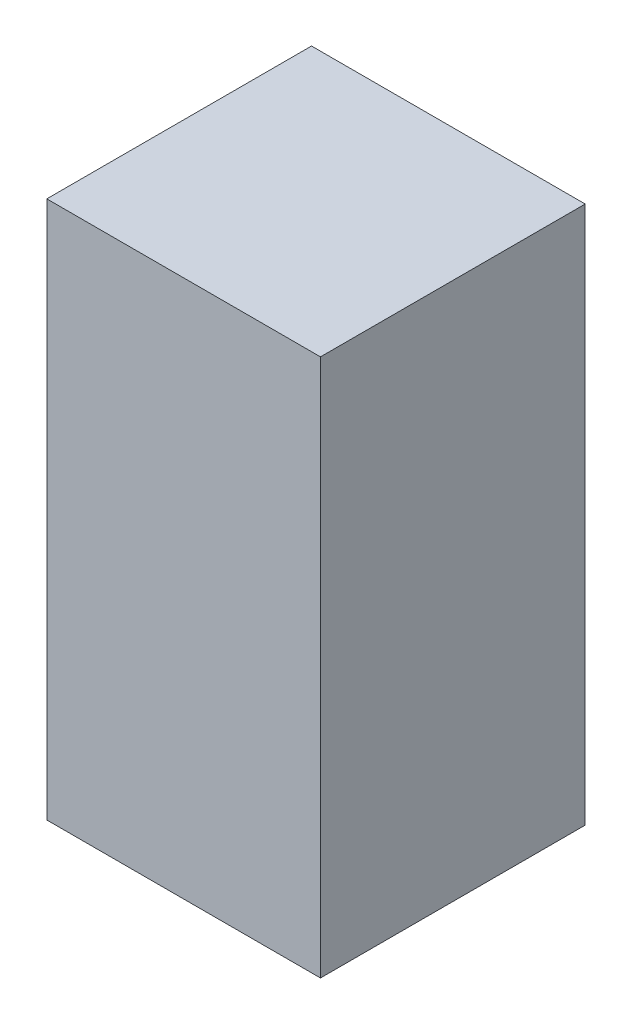
ISO-10303-21;
HEADER;
FILE_DESCRIPTION(('STEP AP214'),'2;1');
FILE_NAME('part.step','',(''),(''),'','','');
FILE_SCHEMA(('AUTOMOTIVE_DESIGN { 1 0 10303 214 1 1 1 1 }'));
ENDSEC;
DATA;
#1=APPLICATION_CONTEXT('core data for automotive mechanical design processes');
#2=APPLICATION_PROTOCOL_DEFINITION('international standard','automotive_design',2000,#1);
#3=PRODUCT_CONTEXT('',#1,'mechanical');
#4=PRODUCT('Part','Part','',(#3));
#5=PRODUCT_RELATED_PRODUCT_CATEGORY('part','',(#4));
#6=PRODUCT_DEFINITION_FORMATION('','',#4);
#7=PRODUCT_DEFINITION_CONTEXT('part definition',#1,'design');
#8=PRODUCT_DEFINITION('design','',#6,#7);
#9=PRODUCT_DEFINITION_SHAPE('','',#8);
#10=(LENGTH_UNIT() NAMED_UNIT(*) SI_UNIT(.MILLI.,.METRE.));
#11=(NAMED_UNIT(*) PLANE_ANGLE_UNIT() SI_UNIT($,.RADIAN.));
#12=(NAMED_UNIT(*) SI_UNIT($,.STERADIAN.) SOLID_ANGLE_UNIT());
#13=UNCERTAINTY_MEASURE_WITH_UNIT(LENGTH_MEASURE(1.E-05),#10,'distance_accuracy_value','');
#14=(GEOMETRIC_REPRESENTATION_CONTEXT(3) GLOBAL_UNCERTAINTY_ASSIGNED_CONTEXT((#13)) GLOBAL_UNIT_ASSIGNED_CONTEXT((#10,
#11,#12)) REPRESENTATION_CONTEXT('',''));
#15=CARTESIAN_POINT('',(0.,0.,0.));
#16=DIRECTION('',(0.,0.,1.));
#17=DIRECTION('',(1.,0.,0.));
#18=AXIS2_PLACEMENT_3D('',#15,#16,#17);
#19=CARTESIAN_POINT('',(-9.017,-1.6002,10.));
#20=DIRECTION('',(1.,0.,0.));
#21=DIRECTION('',(0.,0.,-1.));
#22=AXIS2_PLACEMENT_3D('',#19,#20,#21);
#23=PLANE('',#22);
#24=DIRECTION('',(0.,-1.,0.));
#25=VECTOR('',#24,1.);
#26=CARTESIAN_POINT('',(-9.017,-1.6002,0.));
#27=LINE('',#26,#25);
#28=CARTESIAN_POINT('',(-9.017,18.7198,0.));
#29=VERTEX_POINT('',#28);
#30=CARTESIAN_POINT('',(-9.017,-1.6002,0.));
#31=VERTEX_POINT('',#30);
#32=EDGE_CURVE('E96',#29,#31,#27,.T.);
#33=ORIENTED_EDGE('',*,*,#32,.T.);
#34=DIRECTION('',(0.,0.,-1.));
#35=VECTOR('',#34,1.);
#36=CARTESIAN_POINT('',(-9.017,-1.6002,10.));
#37=LINE('',#36,#35);
#38=CARTESIAN_POINT('',(-9.017,-1.6002,10.));
#39=VERTEX_POINT('',#38);
#40=EDGE_CURVE('E11',#39,#31,#37,.T.);
#41=ORIENTED_EDGE('',*,*,#40,.F.);
#42=DIRECTION('',(0.,-1.,0.));
#43=VECTOR('',#42,1.);
#44=CARTESIAN_POINT('',(-9.017,-1.6002,10.));
#45=LINE('',#44,#43);
#46=CARTESIAN_POINT('',(-9.017,18.7198,10.));
#47=VERTEX_POINT('',#46);
#48=EDGE_CURVE('E84',#47,#39,#45,.T.);
#49=ORIENTED_EDGE('',*,*,#48,.F.);
#50=DIRECTION('',(0.,0.,-1.));
#51=VECTOR('',#50,1.);
#52=CARTESIAN_POINT('',(-9.017,18.7198,10.));
#53=LINE('',#52,#51);
#54=EDGE_CURVE('E92',#47,#29,#53,.T.);
#55=ORIENTED_EDGE('',*,*,#54,.T.);
#56=EDGE_LOOP('',(#33,#41,#49,#55));
#57=FACE_BOUND('',#56,.T.);
#58=ADVANCED_FACE('F33',(#57),#23,.F.);
#59=CARTESIAN_POINT('',(1.3208,-1.6002,10.));
#60=DIRECTION('',(0.,1.,0.));
#61=DIRECTION('',(0.,0.,1.));
#62=AXIS2_PLACEMENT_3D('',#59,#60,#61);
#63=PLANE('',#62);
#64=DIRECTION('',(1.,0.,0.));
#65=VECTOR('',#64,1.);
#66=CARTESIAN_POINT('',(1.3208,-1.6002,0.));
#67=LINE('',#66,#65);
#68=CARTESIAN_POINT('',(1.3208,-1.6002,0.));
#69=VERTEX_POINT('',#68);
#70=EDGE_CURVE('E88',#31,#69,#67,.T.);
#71=ORIENTED_EDGE('',*,*,#70,.T.);
#72=DIRECTION('',(0.,0.,-1.));
#73=VECTOR('',#72,1.);
#74=CARTESIAN_POINT('',(1.3208,-1.6002,10.));
#75=LINE('',#74,#73);
#76=CARTESIAN_POINT('',(1.3208,-1.6002,10.));
#77=VERTEX_POINT('',#76);
#78=EDGE_CURVE('E41',#77,#69,#75,.T.);
#79=ORIENTED_EDGE('',*,*,#78,.F.);
#80=DIRECTION('',(1.,0.,0.));
#81=VECTOR('',#80,1.);
#82=CARTESIAN_POINT('',(1.3208,-1.6002,10.));
#83=LINE('',#82,#81);
#84=EDGE_CURVE('E79',#39,#77,#83,.T.);
#85=ORIENTED_EDGE('',*,*,#84,.F.);
#86=ORIENTED_EDGE('',*,*,#40,.T.);
#87=EDGE_LOOP('',(#71,#79,#85,#86));
#88=FACE_BOUND('',#87,.T.);
#89=ADVANCED_FACE('F87',(#88),#63,.F.);
#90=CARTESIAN_POINT('',(1.3208,18.7198,10.));
#91=DIRECTION('',(-1.,0.,0.));
#92=DIRECTION('',(0.,0.,1.));
#93=AXIS2_PLACEMENT_3D('',#90,#91,#92);
#94=PLANE('',#93);
#95=DIRECTION('',(0.,1.,0.));
#96=VECTOR('',#95,1.);
#97=CARTESIAN_POINT('',(1.3208,18.7198,0.));
#98=LINE('',#97,#96);
#99=CARTESIAN_POINT('',(1.3208,18.7198,0.));
#100=VERTEX_POINT('',#99);
#101=EDGE_CURVE('E66',#69,#100,#98,.T.);
#102=ORIENTED_EDGE('',*,*,#101,.T.);
#103=DIRECTION('',(0.,0.,-1.));
#104=VECTOR('',#103,1.);
#105=CARTESIAN_POINT('',(1.3208,18.7198,10.));
#106=LINE('',#105,#104);
#107=CARTESIAN_POINT('',(1.3208,18.7198,10.));
#108=VERTEX_POINT('',#107);
#109=EDGE_CURVE('E89',#108,#100,#106,.T.);
#110=ORIENTED_EDGE('',*,*,#109,.F.);
#111=DIRECTION('',(0.,1.,0.));
#112=VECTOR('',#111,1.);
#113=CARTESIAN_POINT('',(1.3208,18.7198,10.));
#114=LINE('',#113,#112);
#115=EDGE_CURVE('E82',#77,#108,#114,.T.);
#116=ORIENTED_EDGE('',*,*,#115,.F.);
#117=ORIENTED_EDGE('',*,*,#78,.T.);
#118=EDGE_LOOP('',(#102,#110,#116,#117));
#119=FACE_BOUND('',#118,.T.);
#120=ADVANCED_FACE('F90',(#119),#94,.F.);
#121=CARTESIAN_POINT('',(-9.017,18.7198,10.));
#122=DIRECTION('',(0.,-1.,0.));
#123=DIRECTION('',(0.,0.,-1.));
#124=AXIS2_PLACEMENT_3D('',#121,#122,#123);
#125=PLANE('',#124);
#126=DIRECTION('',(-1.,0.,0.));
#127=VECTOR('',#126,1.);
#128=CARTESIAN_POINT('',(-9.017,18.7198,0.));
#129=LINE('',#128,#127);
#130=EDGE_CURVE('E72',#100,#29,#129,.T.);
#131=ORIENTED_EDGE('',*,*,#130,.T.);
#132=ORIENTED_EDGE('',*,*,#54,.F.);
#133=DIRECTION('',(-1.,0.,0.));
#134=VECTOR('',#133,1.);
#135=CARTESIAN_POINT('',(-9.017,18.7198,10.));
#136=LINE('',#135,#134);
#137=EDGE_CURVE('E49',#108,#47,#136,.T.);
#138=ORIENTED_EDGE('',*,*,#137,.F.);
#139=ORIENTED_EDGE('',*,*,#109,.T.);
#140=EDGE_LOOP('',(#131,#132,#138,#139));
#141=FACE_BOUND('',#140,.T.);
#142=ADVANCED_FACE('F103',(#141),#125,.F.);
#143=CARTESIAN_POINT('',(0.,0.,10.));
#144=DIRECTION('',(0.,0.,-1.));
#145=DIRECTION('',(-1.,0.,0.));
#146=AXIS2_PLACEMENT_3D('',#143,#144,#145);
#147=PLANE('',#146);
#148=ORIENTED_EDGE('',*,*,#48,.T.);
#149=ORIENTED_EDGE('',*,*,#84,.T.);
#150=ORIENTED_EDGE('',*,*,#115,.T.);
#151=ORIENTED_EDGE('',*,*,#137,.T.);
#152=EDGE_LOOP('',(#148,#149,#150,#151));
#153=FACE_BOUND('',#152,.T.);
#154=ADVANCED_FACE('F80',(#153),#147,.F.);
#155=CARTESIAN_POINT('',(0.,0.,0.));
#156=DIRECTION('',(0.,0.,-1.));
#157=DIRECTION('',(-1.,0.,0.));
#158=AXIS2_PLACEMENT_3D('',#155,#156,#157);
#159=PLANE('',#158);
#160=ORIENTED_EDGE('',*,*,#32,.F.);
#161=ORIENTED_EDGE('',*,*,#130,.F.);
#162=ORIENTED_EDGE('',*,*,#101,.F.);
#163=ORIENTED_EDGE('',*,*,#70,.F.);
#164=EDGE_LOOP('',(#160,#161,#162,#163));
#165=FACE_BOUND('',#164,.T.);
#166=ADVANCED_FACE('F106',(#165),#159,.T.);
#167=CLOSED_SHELL('',(#58,#89,#120,#142,#154,#166));
#168=MANIFOLD_SOLID_BREP('B2',#167);
#169=ADVANCED_BREP_SHAPE_REPRESENTATION('',(#18,#168),#14);
#170=SHAPE_DEFINITION_REPRESENTATION(#9,#169);
ENDSEC;
END-ISO-10303-21;
